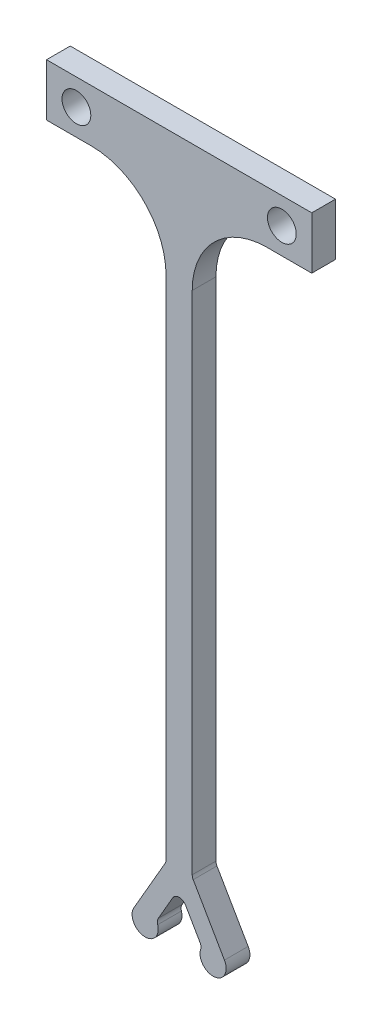
ISO-10303-21;
HEADER;
FILE_DESCRIPTION(('STEP AP214'),'2;1');
FILE_NAME('part.step','',(''),(''),'','','');
FILE_SCHEMA(('AUTOMOTIVE_DESIGN { 1 0 10303 214 1 1 1 1 }'));
ENDSEC;
DATA;
#1=APPLICATION_CONTEXT('core data for automotive mechanical design processes');
#2=APPLICATION_PROTOCOL_DEFINITION('international standard','automotive_design',2000,#1);
#3=PRODUCT_CONTEXT('',#1,'mechanical');
#4=PRODUCT('Part','Part','',(#3));
#5=PRODUCT_RELATED_PRODUCT_CATEGORY('part','',(#4));
#6=PRODUCT_DEFINITION_FORMATION('','',#4);
#7=PRODUCT_DEFINITION_CONTEXT('part definition',#1,'design');
#8=PRODUCT_DEFINITION('design','',#6,#7);
#9=PRODUCT_DEFINITION_SHAPE('','',#8);
#10=(LENGTH_UNIT() NAMED_UNIT(*) SI_UNIT(.MILLI.,.METRE.));
#11=(NAMED_UNIT(*) PLANE_ANGLE_UNIT() SI_UNIT($,.RADIAN.));
#12=(NAMED_UNIT(*) SI_UNIT($,.STERADIAN.) SOLID_ANGLE_UNIT());
#13=UNCERTAINTY_MEASURE_WITH_UNIT(LENGTH_MEASURE(1.E-05),#10,'distance_accuracy_value','');
#14=(GEOMETRIC_REPRESENTATION_CONTEXT(3) GLOBAL_UNCERTAINTY_ASSIGNED_CONTEXT((#13)) GLOBAL_UNIT_ASSIGNED_CONTEXT((#10,
#11,#12)) REPRESENTATION_CONTEXT('',''));
#15=CARTESIAN_POINT('',(0.,0.,0.));
#16=DIRECTION('',(0.,0.,1.));
#17=DIRECTION('',(1.,0.,0.));
#18=AXIS2_PLACEMENT_3D('',#15,#16,#17);
#19=CARTESIAN_POINT('',(-11.7499999999945,73.7189110867535,3.175));
#20=DIRECTION('',(0.,0.,-1.));
#21=DIRECTION('',(-1.,0.,0.));
#22=AXIS2_PLACEMENT_3D('',#19,#20,#21);
#23=PLANE('',#22);
#24=DIRECTION('',(1.,0.,0.));
#25=VECTOR('',#24,1.);
#26=CARTESIAN_POINT('',(-17.7499999997513,83.7189110867535,3.175));
#27=LINE('',#26,#25);
#28=CARTESIAN_POINT('',(-17.7499999997513,83.7189110867535,3.175));
#29=VERTEX_POINT('',#28);
#30=CARTESIAN_POINT('',(-11.7499999999945,83.7189110867535,3.175));
#31=VERTEX_POINT('',#30);
#32=EDGE_CURVE('E253',#29,#31,#27,.T.);
#33=ORIENTED_EDGE('',*,*,#32,.T.);
#34=CARTESIAN_POINT('',(-11.7499999999945,73.7189110867535,3.175));
#35=DIRECTION('',(0.,0.,-1.));
#36=DIRECTION('',(-1.,0.,0.));
#37=AXIS2_PLACEMENT_3D('',#34,#35,#36);
#38=CIRCLE('',#37,9.99999999999998);
#39=CARTESIAN_POINT('',(-1.74999999999453,73.7189110867527,3.175));
#40=VERTEX_POINT('',#39);
#41=EDGE_CURVE('E140',#31,#40,#38,.T.);
#42=ORIENTED_EDGE('',*,*,#41,.T.);
#43=DIRECTION('',(0.,-1.,0.));
#44=VECTOR('',#43,1.);
#45=CARTESIAN_POINT('',(-1.74999999999963,5.98686027918463,3.175));
#46=LINE('',#45,#44);
#47=CARTESIAN_POINT('',(-1.74999999999963,5.9868602791847,3.175));
#48=VERTEX_POINT('',#47);
#49=EDGE_CURVE('E304',#40,#48,#46,.T.);
#50=ORIENTED_EDGE('',*,*,#49,.T.);
#51=CARTESIAN_POINT('',(-2.74999999999963,5.9868602791847,3.175));
#52=DIRECTION('',(0.,0.,-1.));
#53=DIRECTION('',(1.,0.,0.));
#54=AXIS2_PLACEMENT_3D('',#51,#52,#53);
#55=CIRCLE('',#54,1.);
#56=CARTESIAN_POINT('',(-1.88397459621522,5.48686027918464,3.175));
#57=VERTEX_POINT('',#56);
#58=EDGE_CURVE('E321',#48,#57,#55,.T.);
#59=ORIENTED_EDGE('',*,*,#58,.T.);
#60=DIRECTION('',(-0.500000000000065,-0.866025403784401,0.));
#61=VECTOR('',#60,1.);
#62=CARTESIAN_POINT('',(-1.88397459621522,5.48686027918464,3.175));
#63=LINE('',#62,#61);
#64=CARTESIAN_POINT('',(-6.06217782649076,-1.74999999999973,3.175));
#65=VERTEX_POINT('',#64);
#66=EDGE_CURVE('E318',#57,#65,#63,.T.);
#67=ORIENTED_EDGE('',*,*,#66,.T.);
#68=CARTESIAN_POINT('',(-4.54663336986805,-2.62499999999984,3.175));
#69=DIRECTION('',(0.,0.,1.));
#70=DIRECTION('',(1.,0.,0.));
#71=AXIS2_PLACEMENT_3D('',#68,#69,#70);
#72=CIRCLE('',#71,1.75);
#73=CARTESIAN_POINT('',(-2.87322613480697,-2.11293728348437,3.175));
#74=VERTEX_POINT('',#73);
#75=EDGE_CURVE('E319',#65,#74,#72,.T.);
#76=ORIENTED_EDGE('',*,*,#75,.T.);
#77=CARTESIAN_POINT('',(-1.91699342905777,-1.8203300169041,3.175));
#78=DIRECTION('',(0.,0.,-1.));
#79=DIRECTION('',(-1.,0.,0.));
#80=AXIS2_PLACEMENT_3D('',#77,#78,#79);
#81=CIRCLE('',#80,1.);
#82=CARTESIAN_POINT('',(-2.78301883284217,-1.32033001690403,3.175));
#83=VERTEX_POINT('',#82);
#84=EDGE_CURVE('E323',#74,#83,#81,.T.);
#85=ORIENTED_EDGE('',*,*,#84,.T.);
#86=DIRECTION('',(0.500000000000065,0.866025403784401,0.));
#87=VECTOR('',#86,1.);
#88=CARTESIAN_POINT('',(-2.78301883284217,-1.32033001690403,3.175));
#89=LINE('',#88,#87);
#90=CARTESIAN_POINT('',(-0.866025403784479,1.99999999999901,3.175));
#91=VERTEX_POINT('',#90);
#92=EDGE_CURVE('E328',#83,#91,#89,.T.);
#93=ORIENTED_EDGE('',*,*,#92,.T.);
#94=CARTESIAN_POINT('',(0.,1.49999999999894,3.175));
#95=DIRECTION('',(0.,0.,-1.));
#96=DIRECTION('',(1.,0.,0.));
#97=AXIS2_PLACEMENT_3D('',#94,#95,#96);
#98=CIRCLE('',#97,1.);
#99=CARTESIAN_POINT('',(0.866025403784362,1.99999999999894,3.175));
#100=VERTEX_POINT('',#99);
#101=EDGE_CURVE('E332',#91,#100,#98,.T.);
#102=ORIENTED_EDGE('',*,*,#101,.T.);
#103=DIRECTION('',(0.499999999999997,-0.86602540378444,0.));
#104=VECTOR('',#103,1.);
#105=CARTESIAN_POINT('',(2.78301883284143,-1.32033001690361,3.175));
#106=LINE('',#105,#104);
#107=CARTESIAN_POINT('',(2.78301883284143,-1.32033001690361,3.175));
#108=VERTEX_POINT('',#107);
#109=EDGE_CURVE('E334',#100,#108,#106,.T.);
#110=ORIENTED_EDGE('',*,*,#109,.T.);
#111=CARTESIAN_POINT('',(1.91699342905699,-1.82033001690361,3.175));
#112=DIRECTION('',(0.,0.,-1.));
#113=DIRECTION('',(-1.,0.,0.));
#114=AXIS2_PLACEMENT_3D('',#111,#112,#113);
#115=CIRCLE('',#114,0.999999999999999);
#116=CARTESIAN_POINT('',(2.87322613480613,-2.11293728348389,3.175));
#117=VERTEX_POINT('',#116);
#118=EDGE_CURVE('E333',#108,#117,#115,.T.);
#119=ORIENTED_EDGE('',*,*,#118,.T.);
#120=CARTESIAN_POINT('',(4.54663336986725,-2.62499999999941,3.175));
#121=DIRECTION('',(0.,0.,1.));
#122=DIRECTION('',(1.,0.,0.));
#123=AXIS2_PLACEMENT_3D('',#120,#121,#122);
#124=CIRCLE('',#123,1.75000000000004);
#125=CARTESIAN_POINT('',(6.0621778264901,-1.74999999999937,3.175));
#126=VERTEX_POINT('',#125);
#127=EDGE_CURVE('E340',#117,#126,#124,.T.);
#128=ORIENTED_EDGE('',*,*,#127,.T.);
#129=DIRECTION('',(-0.499999999999997,0.86602540378444,0.));
#130=VECTOR('',#129,1.);
#131=CARTESIAN_POINT('',(1.8839745962163,5.48686027918331,3.175));
#132=LINE('',#131,#130);
#133=CARTESIAN_POINT('',(1.8839745962163,5.48686027918331,3.175));
#134=VERTEX_POINT('',#133);
#135=EDGE_CURVE('E338',#126,#134,#132,.T.);
#136=ORIENTED_EDGE('',*,*,#135,.T.);
#137=CARTESIAN_POINT('',(2.75000000000073,5.98686027918332,3.175));
#138=DIRECTION('',(0.,0.,-1.));
#139=DIRECTION('',(-1.,0.,0.));
#140=AXIS2_PLACEMENT_3D('',#137,#138,#139);
#141=CIRCLE('',#140,0.999999999999996);
#142=CARTESIAN_POINT('',(1.75000000000074,5.98686027918338,3.175));
#143=VERTEX_POINT('',#142);
#144=EDGE_CURVE('E342',#134,#143,#141,.T.);
#145=ORIENTED_EDGE('',*,*,#144,.T.);
#146=DIRECTION('',(0.,1.,0.));
#147=VECTOR('',#146,1.);
#148=CARTESIAN_POINT('',(1.75000000000074,5.98686027918338,3.175));
#149=LINE('',#148,#147);
#150=CARTESIAN_POINT('',(1.75000000000583,73.7189110867543,3.175));
#151=VERTEX_POINT('',#150);
#152=EDGE_CURVE('E345',#143,#151,#149,.T.);
#153=ORIENTED_EDGE('',*,*,#152,.T.);
#154=CARTESIAN_POINT('',(11.7500000000058,73.7189110867535,3.175));
#155=DIRECTION('',(0.,0.,-1.));
#156=DIRECTION('',(1.,0.,0.));
#157=AXIS2_PLACEMENT_3D('',#154,#155,#156);
#158=CIRCLE('',#157,9.99999999999998);
#159=CARTESIAN_POINT('',(11.7500000000058,83.7189110867535,3.175));
#160=VERTEX_POINT('',#159);
#161=EDGE_CURVE('E343',#151,#160,#158,.T.);
#162=ORIENTED_EDGE('',*,*,#161,.T.);
#163=DIRECTION('',(1.,0.,0.));
#164=VECTOR('',#163,1.);
#165=CARTESIAN_POINT('',(11.7500000000058,83.7189110867535,3.175));
#166=LINE('',#165,#164);
#167=CARTESIAN_POINT('',(17.750000000249,83.7189110867535,3.175));
#168=VERTEX_POINT('',#167);
#169=EDGE_CURVE('E195',#160,#168,#166,.T.);
#170=ORIENTED_EDGE('',*,*,#169,.T.);
#171=DIRECTION('',(0.,1.,0.));
#172=VECTOR('',#171,1.);
#173=CARTESIAN_POINT('',(17.750000000249,83.7189110867535,3.175));
#174=LINE('',#173,#172);
#175=CARTESIAN_POINT('',(17.750000000249,90.7189110867536,3.175));
#176=VERTEX_POINT('',#175);
#177=EDGE_CURVE('E190',#168,#176,#174,.T.);
#178=ORIENTED_EDGE('',*,*,#177,.T.);
#179=DIRECTION('',(-1.,0.,0.));
#180=VECTOR('',#179,1.);
#181=CARTESIAN_POINT('',(1.75000000024901,90.7189110867535,3.175));
#182=LINE('',#181,#180);
#183=CARTESIAN_POINT('',(-17.7499999997513,90.7189110867535,3.175));
#184=VERTEX_POINT('',#183);
#185=EDGE_CURVE('E192',#176,#184,#182,.T.);
#186=ORIENTED_EDGE('',*,*,#185,.T.);
#187=DIRECTION('',(0.,-1.,0.));
#188=VECTOR('',#187,1.);
#189=CARTESIAN_POINT('',(-17.7499999997513,90.7189110867535,3.175));
#190=LINE('',#189,#188);
#191=EDGE_CURVE('E58',#184,#29,#190,.T.);
#192=ORIENTED_EDGE('',*,*,#191,.T.);
#193=EDGE_LOOP('',(#33,#42,#50,#59,#67,#76,#85,#93,#102,#110,#119,#128,#136,#145,#153,#162,#170,
#178,#186,#192));
#194=FACE_BOUND('',#193,.T.);
#195=CARTESIAN_POINT('',(-13.7499999997513,87.2189110867535,3.175));
#196=DIRECTION('',(0.,0.,1.));
#197=DIRECTION('',(1.,0.,0.));
#198=AXIS2_PLACEMENT_3D('',#195,#196,#197);
#199=CIRCLE('',#198,1.925);
#200=CARTESIAN_POINT('',(-11.8249999997513,87.2189110867535,3.175));
#201=VERTEX_POINT('',#200);
#202=EDGE_CURVE('E216',#201,#201,#199,.T.);
#203=ORIENTED_EDGE('',*,*,#202,.F.);
#204=EDGE_LOOP('',(#203));
#205=FACE_BOUND('',#204,.T.);
#206=CARTESIAN_POINT('',(13.750000000249,87.2189110867535,3.175));
#207=DIRECTION('',(0.,0.,1.));
#208=DIRECTION('',(1.,0.,0.));
#209=AXIS2_PLACEMENT_3D('',#206,#207,#208);
#210=CIRCLE('',#209,1.925);
#211=CARTESIAN_POINT('',(15.675000000249,87.2189110867535,3.175));
#212=VERTEX_POINT('',#211);
#213=EDGE_CURVE('E387',#212,#212,#210,.T.);
#214=ORIENTED_EDGE('',*,*,#213,.F.);
#215=EDGE_LOOP('',(#214));
#216=FACE_BOUND('',#215,.T.);
#217=ADVANCED_FACE('F43',(#194,#205,#216),#23,.F.);
#218=CARTESIAN_POINT('',(-11.7499999999945,73.7189110867535,0.));
#219=DIRECTION('',(0.,0.,-1.));
#220=DIRECTION('',(-1.,0.,0.));
#221=AXIS2_PLACEMENT_3D('',#218,#219,#220);
#222=PLANE('',#221);
#223=CARTESIAN_POINT('',(-13.7499999997513,87.2189110867535,0.));
#224=DIRECTION('',(0.,0.,1.));
#225=DIRECTION('',(1.,0.,0.));
#226=AXIS2_PLACEMENT_3D('',#223,#224,#225);
#227=CIRCLE('',#226,1.925);
#228=CARTESIAN_POINT('',(-11.8249999997513,87.2189110867535,0.));
#229=VERTEX_POINT('',#228);
#230=EDGE_CURVE('E391',#229,#229,#227,.T.);
#231=ORIENTED_EDGE('',*,*,#230,.T.);
#232=EDGE_LOOP('',(#231));
#233=FACE_BOUND('',#232,.T.);
#234=DIRECTION('',(1.,0.,0.));
#235=VECTOR('',#234,1.);
#236=CARTESIAN_POINT('',(-17.7499999997513,83.7189110867535,0.));
#237=LINE('',#236,#235);
#238=CARTESIAN_POINT('',(-17.7499999997513,83.7189110867535,0.));
#239=VERTEX_POINT('',#238);
#240=CARTESIAN_POINT('',(-11.7499999999945,83.7189110867535,0.));
#241=VERTEX_POINT('',#240);
#242=EDGE_CURVE('E215',#239,#241,#237,.T.);
#243=ORIENTED_EDGE('',*,*,#242,.F.);
#244=DIRECTION('',(0.,-1.,0.));
#245=VECTOR('',#244,1.);
#246=CARTESIAN_POINT('',(-17.7499999997513,90.7189110867535,0.));
#247=LINE('',#246,#245);
#248=CARTESIAN_POINT('',(-17.7499999997513,90.7189110867535,0.));
#249=VERTEX_POINT('',#248);
#250=EDGE_CURVE('E128',#249,#239,#247,.T.);
#251=ORIENTED_EDGE('',*,*,#250,.F.);
#252=DIRECTION('',(-1.,0.,0.));
#253=VECTOR('',#252,1.);
#254=CARTESIAN_POINT('',(-1.74999999975131,90.7189110867535,0.));
#255=LINE('',#254,#253);
#256=CARTESIAN_POINT('',(17.750000000249,90.7189110867536,0.));
#257=VERTEX_POINT('',#256);
#258=EDGE_CURVE('E121',#257,#249,#255,.T.);
#259=ORIENTED_EDGE('',*,*,#258,.F.);
#260=DIRECTION('',(0.,1.,0.));
#261=VECTOR('',#260,1.);
#262=CARTESIAN_POINT('',(17.750000000249,83.7189110867535,0.));
#263=LINE('',#262,#261);
#264=CARTESIAN_POINT('',(17.750000000249,83.7189110867535,0.));
#265=VERTEX_POINT('',#264);
#266=EDGE_CURVE('E205',#265,#257,#263,.T.);
#267=ORIENTED_EDGE('',*,*,#266,.F.);
#268=DIRECTION('',(1.,0.,0.));
#269=VECTOR('',#268,1.);
#270=CARTESIAN_POINT('',(11.7500000000058,83.7189110867535,0.));
#271=LINE('',#270,#269);
#272=CARTESIAN_POINT('',(11.7500000000058,83.7189110867535,0.));
#273=VERTEX_POINT('',#272);
#274=EDGE_CURVE('E247',#273,#265,#271,.T.);
#275=ORIENTED_EDGE('',*,*,#274,.F.);
#276=CARTESIAN_POINT('',(11.7500000000058,73.7189110867535,0.));
#277=DIRECTION('',(0.,0.,-1.));
#278=DIRECTION('',(1.,0.,0.));
#279=AXIS2_PLACEMENT_3D('',#276,#277,#278);
#280=CIRCLE('',#279,9.99999999999998);
#281=CARTESIAN_POINT('',(1.75000000000583,73.7189110867543,0.));
#282=VERTEX_POINT('',#281);
#283=EDGE_CURVE('E243',#282,#273,#280,.T.);
#284=ORIENTED_EDGE('',*,*,#283,.F.);
#285=DIRECTION('',(0.,1.,0.));
#286=VECTOR('',#285,1.);
#287=CARTESIAN_POINT('',(1.75000000000074,5.98686027918338,0.));
#288=LINE('',#287,#286);
#289=CARTESIAN_POINT('',(1.75000000000074,5.98686027918338,0.));
#290=VERTEX_POINT('',#289);
#291=EDGE_CURVE('E245',#290,#282,#288,.T.);
#292=ORIENTED_EDGE('',*,*,#291,.F.);
#293=CARTESIAN_POINT('',(2.75000000000073,5.98686027918332,0.));
#294=DIRECTION('',(0.,0.,-1.));
#295=DIRECTION('',(-1.,0.,0.));
#296=AXIS2_PLACEMENT_3D('',#293,#294,#295);
#297=CIRCLE('',#296,0.999999999999996);
#298=CARTESIAN_POINT('',(1.8839745962163,5.48686027918331,0.));
#299=VERTEX_POINT('',#298);
#300=EDGE_CURVE('E238',#299,#290,#297,.T.);
#301=ORIENTED_EDGE('',*,*,#300,.F.);
#302=DIRECTION('',(-0.499999999999997,0.86602540378444,0.));
#303=VECTOR('',#302,1.);
#304=CARTESIAN_POINT('',(1.8839745962163,5.48686027918331,0.));
#305=LINE('',#304,#303);
#306=CARTESIAN_POINT('',(6.0621778264901,-1.74999999999937,0.));
#307=VERTEX_POINT('',#306);
#308=EDGE_CURVE('E236',#307,#299,#305,.T.);
#309=ORIENTED_EDGE('',*,*,#308,.F.);
#310=CARTESIAN_POINT('',(4.54663336986725,-2.62499999999941,0.));
#311=DIRECTION('',(0.,0.,1.));
#312=DIRECTION('',(1.,0.,0.));
#313=AXIS2_PLACEMENT_3D('',#310,#311,#312);
#314=CIRCLE('',#313,1.75000000000004);
#315=CARTESIAN_POINT('',(2.87322613480613,-2.11293728348389,0.));
#316=VERTEX_POINT('',#315);
#317=EDGE_CURVE('E237',#316,#307,#314,.T.);
#318=ORIENTED_EDGE('',*,*,#317,.F.);
#319=CARTESIAN_POINT('',(1.91699342905699,-1.82033001690361,0.));
#320=DIRECTION('',(0.,0.,-1.));
#321=DIRECTION('',(-1.,0.,0.));
#322=AXIS2_PLACEMENT_3D('',#319,#320,#321);
#323=CIRCLE('',#322,0.999999999999999);
#324=CARTESIAN_POINT('',(2.78301883284143,-1.32033001690361,0.));
#325=VERTEX_POINT('',#324);
#326=EDGE_CURVE('E231',#325,#316,#323,.T.);
#327=ORIENTED_EDGE('',*,*,#326,.F.);
#328=DIRECTION('',(0.499999999999997,-0.86602540378444,0.));
#329=VECTOR('',#328,1.);
#330=CARTESIAN_POINT('',(2.78301883284143,-1.32033001690361,0.));
#331=LINE('',#330,#329);
#332=CARTESIAN_POINT('',(0.866025403784362,1.99999999999894,0.));
#333=VERTEX_POINT('',#332);
#334=EDGE_CURVE('E234',#333,#325,#331,.T.);
#335=ORIENTED_EDGE('',*,*,#334,.F.);
#336=CARTESIAN_POINT('',(0.,1.49999999999894,0.));
#337=DIRECTION('',(0.,0.,-1.));
#338=DIRECTION('',(1.,0.,0.));
#339=AXIS2_PLACEMENT_3D('',#336,#337,#338);
#340=CIRCLE('',#339,1.);
#341=CARTESIAN_POINT('',(-0.866025403784479,1.99999999999901,0.));
#342=VERTEX_POINT('',#341);
#343=EDGE_CURVE('E229',#342,#333,#340,.T.);
#344=ORIENTED_EDGE('',*,*,#343,.F.);
#345=DIRECTION('',(0.500000000000065,0.866025403784401,0.));
#346=VECTOR('',#345,1.);
#347=CARTESIAN_POINT('',(-2.78301883284217,-1.32033001690403,0.));
#348=LINE('',#347,#346);
#349=CARTESIAN_POINT('',(-2.78301883284217,-1.32033001690403,0.));
#350=VERTEX_POINT('',#349);
#351=EDGE_CURVE('E227',#350,#342,#348,.T.);
#352=ORIENTED_EDGE('',*,*,#351,.F.);
#353=CARTESIAN_POINT('',(-1.91699342905777,-1.8203300169041,0.));
#354=DIRECTION('',(0.,0.,-1.));
#355=DIRECTION('',(-1.,0.,0.));
#356=AXIS2_PLACEMENT_3D('',#353,#354,#355);
#357=CIRCLE('',#356,1.);
#358=CARTESIAN_POINT('',(-2.87322613480697,-2.11293728348437,0.));
#359=VERTEX_POINT('',#358);
#360=EDGE_CURVE('E226',#359,#350,#357,.T.);
#361=ORIENTED_EDGE('',*,*,#360,.F.);
#362=CARTESIAN_POINT('',(-4.54663336986805,-2.62499999999984,0.));
#363=DIRECTION('',(0.,0.,1.));
#364=DIRECTION('',(1.,0.,0.));
#365=AXIS2_PLACEMENT_3D('',#362,#363,#364);
#366=CIRCLE('',#365,1.75);
#367=CARTESIAN_POINT('',(-6.06217782649076,-1.74999999999973,0.));
#368=VERTEX_POINT('',#367);
#369=EDGE_CURVE('E221',#368,#359,#366,.T.);
#370=ORIENTED_EDGE('',*,*,#369,.F.);
#371=DIRECTION('',(-0.500000000000065,-0.866025403784401,0.));
#372=VECTOR('',#371,1.);
#373=CARTESIAN_POINT('',(-1.88397459621522,5.48686027918464,0.));
#374=LINE('',#373,#372);
#375=CARTESIAN_POINT('',(-1.88397459621522,5.48686027918464,0.));
#376=VERTEX_POINT('',#375);
#377=EDGE_CURVE('E225',#376,#368,#374,.T.);
#378=ORIENTED_EDGE('',*,*,#377,.F.);
#379=CARTESIAN_POINT('',(-2.74999999999963,5.9868602791847,0.));
#380=DIRECTION('',(0.,0.,-1.));
#381=DIRECTION('',(1.,0.,0.));
#382=AXIS2_PLACEMENT_3D('',#379,#380,#381);
#383=CIRCLE('',#382,1.);
#384=CARTESIAN_POINT('',(-1.74999999999963,5.9868602791847,0.));
#385=VERTEX_POINT('',#384);
#386=EDGE_CURVE('E219',#385,#376,#383,.T.);
#387=ORIENTED_EDGE('',*,*,#386,.F.);
#388=DIRECTION('',(0.,-1.,0.));
#389=VECTOR('',#388,1.);
#390=CARTESIAN_POINT('',(-1.74999999999963,5.98686027918463,0.));
#391=LINE('',#390,#389);
#392=CARTESIAN_POINT('',(-1.74999999999453,73.7189110867527,0.));
#393=VERTEX_POINT('',#392);
#394=EDGE_CURVE('E217',#393,#385,#391,.T.);
#395=ORIENTED_EDGE('',*,*,#394,.F.);
#396=CARTESIAN_POINT('',(-11.7499999999945,73.7189110867535,0.));
#397=DIRECTION('',(0.,0.,-1.));
#398=DIRECTION('',(-1.,0.,0.));
#399=AXIS2_PLACEMENT_3D('',#396,#397,#398);
#400=CIRCLE('',#399,9.99999999999998);
#401=EDGE_CURVE('E214',#241,#393,#400,.T.);
#402=ORIENTED_EDGE('',*,*,#401,.F.);
#403=EDGE_LOOP('',(#243,#251,#259,#267,#275,#284,#292,#301,#309,#318,#327,#335,#344,#352,#361,
#370,#378,#387,#395,#402));
#404=FACE_BOUND('',#403,.T.);
#405=CARTESIAN_POINT('',(13.750000000249,87.2189110867535,0.));
#406=DIRECTION('',(0.,0.,1.));
#407=DIRECTION('',(1.,0.,0.));
#408=AXIS2_PLACEMENT_3D('',#405,#406,#407);
#409=CIRCLE('',#408,1.925);
#410=CARTESIAN_POINT('',(15.675000000249,87.2189110867535,0.));
#411=VERTEX_POINT('',#410);
#412=EDGE_CURVE('E386',#411,#411,#409,.T.);
#413=ORIENTED_EDGE('',*,*,#412,.T.);
#414=EDGE_LOOP('',(#413));
#415=FACE_BOUND('',#414,.T.);
#416=ADVANCED_FACE('F308',(#233,#404,#415),#222,.T.);
#417=CARTESIAN_POINT('',(-17.7499999997513,83.7189110867535,3.175));
#418=DIRECTION('',(0.,1.,0.));
#419=DIRECTION('',(-1.,0.,0.));
#420=AXIS2_PLACEMENT_3D('',#417,#418,#419);
#421=PLANE('',#420);
#422=ORIENTED_EDGE('',*,*,#242,.T.);
#423=DIRECTION('',(0.,0.,-1.));
#424=VECTOR('',#423,1.);
#425=CARTESIAN_POINT('',(-11.7499999999945,83.7189110867535,3.175));
#426=LINE('',#425,#424);
#427=EDGE_CURVE('E11',#31,#241,#426,.T.);
#428=ORIENTED_EDGE('',*,*,#427,.F.);
#429=ORIENTED_EDGE('',*,*,#32,.F.);
#430=DIRECTION('',(0.,0.,-1.));
#431=VECTOR('',#430,1.);
#432=CARTESIAN_POINT('',(-17.7499999997513,83.7189110867535,3.175));
#433=LINE('',#432,#431);
#434=EDGE_CURVE('E208',#29,#239,#433,.T.);
#435=ORIENTED_EDGE('',*,*,#434,.T.);
#436=EDGE_LOOP('',(#422,#428,#429,#435));
#437=FACE_BOUND('',#436,.T.);
#438=ADVANCED_FACE('F44',(#437),#421,.F.);
#439=CARTESIAN_POINT('',(-11.7499999999945,73.7189110867535,3.175));
#440=DIRECTION('',(0.,0.,-1.));
#441=DIRECTION('',(-1.,0.,0.));
#442=AXIS2_PLACEMENT_3D('',#439,#440,#441);
#443=CYLINDRICAL_SURFACE('',#442,9.99999999999998);
#444=ORIENTED_EDGE('',*,*,#401,.T.);
#445=DIRECTION('',(0.,0.,-1.));
#446=VECTOR('',#445,1.);
#447=CARTESIAN_POINT('',(-1.74999999999453,73.7189110867527,3.175));
#448=LINE('',#447,#446);
#449=EDGE_CURVE('E55',#40,#393,#448,.T.);
#450=ORIENTED_EDGE('',*,*,#449,.F.);
#451=ORIENTED_EDGE('',*,*,#41,.F.);
#452=ORIENTED_EDGE('',*,*,#427,.T.);
#453=EDGE_LOOP('',(#444,#450,#451,#452));
#454=FACE_BOUND('',#453,.T.);
#455=ADVANCED_FACE('F551',(#454),#443,.F.);
#456=CARTESIAN_POINT('',(-1.74999999999963,5.98686027918463,3.175));
#457=DIRECTION('',(1.,0.,0.));
#458=DIRECTION('',(0.,1.,0.));
#459=AXIS2_PLACEMENT_3D('',#456,#457,#458);
#460=PLANE('',#459);
#461=ORIENTED_EDGE('',*,*,#394,.T.);
#462=DIRECTION('',(0.,0.,-1.));
#463=VECTOR('',#462,1.);
#464=CARTESIAN_POINT('',(-1.74999999999963,5.9868602791847,3.175));
#465=LINE('',#464,#463);
#466=EDGE_CURVE('E294',#48,#385,#465,.T.);
#467=ORIENTED_EDGE('',*,*,#466,.F.);
#468=ORIENTED_EDGE('',*,*,#49,.F.);
#469=ORIENTED_EDGE('',*,*,#449,.T.);
#470=EDGE_LOOP('',(#461,#467,#468,#469));
#471=FACE_BOUND('',#470,.T.);
#472=ADVANCED_FACE('F299',(#471),#460,.F.);
#473=CARTESIAN_POINT('',(-2.74999999999963,5.9868602791847,3.175));
#474=DIRECTION('',(0.,0.,-1.));
#475=DIRECTION('',(-1.,0.,0.));
#476=AXIS2_PLACEMENT_3D('',#473,#474,#475);
#477=CYLINDRICAL_SURFACE('',#476,1.);
#478=ORIENTED_EDGE('',*,*,#386,.T.);
#479=DIRECTION('',(0.,0.,-1.));
#480=VECTOR('',#479,1.);
#481=CARTESIAN_POINT('',(-1.88397459621522,5.48686027918464,3.175));
#482=LINE('',#481,#480);
#483=EDGE_CURVE('E292',#57,#376,#482,.T.);
#484=ORIENTED_EDGE('',*,*,#483,.F.);
#485=ORIENTED_EDGE('',*,*,#58,.F.);
#486=ORIENTED_EDGE('',*,*,#466,.T.);
#487=EDGE_LOOP('',(#478,#484,#485,#486));
#488=FACE_BOUND('',#487,.T.);
#489=ADVANCED_FACE('F315',(#488),#477,.F.);
#490=CARTESIAN_POINT('',(-1.88397459621522,5.48686027918464,3.175));
#491=DIRECTION('',(0.866025403784401,-0.500000000000065,0.));
#492=DIRECTION('',(0.500000000000065,0.866025403784401,0.));
#493=AXIS2_PLACEMENT_3D('',#490,#491,#492);
#494=PLANE('',#493);
#495=ORIENTED_EDGE('',*,*,#377,.T.);
#496=DIRECTION('',(0.,0.,-1.));
#497=VECTOR('',#496,1.);
#498=CARTESIAN_POINT('',(-6.06217782649076,-1.74999999999973,3.175));
#499=LINE('',#498,#497);
#500=EDGE_CURVE('E290',#65,#368,#499,.T.);
#501=ORIENTED_EDGE('',*,*,#500,.F.);
#502=ORIENTED_EDGE('',*,*,#66,.F.);
#503=ORIENTED_EDGE('',*,*,#483,.T.);
#504=EDGE_LOOP('',(#495,#501,#502,#503));
#505=FACE_BOUND('',#504,.T.);
#506=ADVANCED_FACE('F316',(#505),#494,.F.);
#507=CARTESIAN_POINT('',(-4.54663336986805,-2.62499999999984,3.175));
#508=DIRECTION('',(0.,0.,-1.));
#509=DIRECTION('',(-1.,0.,0.));
#510=AXIS2_PLACEMENT_3D('',#507,#508,#509);
#511=CYLINDRICAL_SURFACE('',#510,1.75);
#512=ORIENTED_EDGE('',*,*,#369,.T.);
#513=DIRECTION('',(0.,0.,-1.));
#514=VECTOR('',#513,1.);
#515=CARTESIAN_POINT('',(-2.87322613480697,-2.11293728348437,3.175));
#516=LINE('',#515,#514);
#517=EDGE_CURVE('E284',#74,#359,#516,.T.);
#518=ORIENTED_EDGE('',*,*,#517,.F.);
#519=ORIENTED_EDGE('',*,*,#75,.F.);
#520=ORIENTED_EDGE('',*,*,#500,.T.);
#521=EDGE_LOOP('',(#512,#518,#519,#520));
#522=FACE_BOUND('',#521,.T.);
#523=ADVANCED_FACE('F525',(#522),#511,.T.);
#524=CARTESIAN_POINT('',(-1.91699342905777,-1.8203300169041,3.175));
#525=DIRECTION('',(0.,0.,-1.));
#526=DIRECTION('',(-1.,0.,0.));
#527=AXIS2_PLACEMENT_3D('',#524,#525,#526);
#528=CYLINDRICAL_SURFACE('',#527,1.);
#529=ORIENTED_EDGE('',*,*,#360,.T.);
#530=DIRECTION('',(0.,0.,-1.));
#531=VECTOR('',#530,1.);
#532=CARTESIAN_POINT('',(-2.78301883284217,-1.32033001690403,3.175));
#533=LINE('',#532,#531);
#534=EDGE_CURVE('E285',#83,#350,#533,.T.);
#535=ORIENTED_EDGE('',*,*,#534,.F.);
#536=ORIENTED_EDGE('',*,*,#84,.F.);
#537=ORIENTED_EDGE('',*,*,#517,.T.);
#538=EDGE_LOOP('',(#529,#535,#536,#537));
#539=FACE_BOUND('',#538,.T.);
#540=ADVANCED_FACE('F514',(#539),#528,.F.);
#541=CARTESIAN_POINT('',(-2.78301883284217,-1.32033001690403,3.175));
#542=DIRECTION('',(-0.866025403784401,0.500000000000065,0.));
#543=DIRECTION('',(-0.500000000000065,-0.866025403784401,0.));
#544=AXIS2_PLACEMENT_3D('',#541,#542,#543);
#545=PLANE('',#544);
#546=ORIENTED_EDGE('',*,*,#351,.T.);
#547=DIRECTION('',(0.,0.,-1.));
#548=VECTOR('',#547,1.);
#549=CARTESIAN_POINT('',(-0.866025403784479,1.99999999999901,3.175));
#550=LINE('',#549,#548);
#551=EDGE_CURVE('E276',#91,#342,#550,.T.);
#552=ORIENTED_EDGE('',*,*,#551,.F.);
#553=ORIENTED_EDGE('',*,*,#92,.F.);
#554=ORIENTED_EDGE('',*,*,#534,.T.);
#555=EDGE_LOOP('',(#546,#552,#553,#554));
#556=FACE_BOUND('',#555,.T.);
#557=ADVANCED_FACE('F504',(#556),#545,.F.);
#558=CARTESIAN_POINT('',(0.,1.49999999999894,3.175));
#559=DIRECTION('',(0.,0.,-1.));
#560=DIRECTION('',(-1.,0.,0.));
#561=AXIS2_PLACEMENT_3D('',#558,#559,#560);
#562=CYLINDRICAL_SURFACE('',#561,1.);
#563=ORIENTED_EDGE('',*,*,#343,.T.);
#564=DIRECTION('',(0.,0.,-1.));
#565=VECTOR('',#564,1.);
#566=CARTESIAN_POINT('',(0.866025403784362,1.99999999999894,3.175));
#567=LINE('',#566,#565);
#568=EDGE_CURVE('E277',#100,#333,#567,.T.);
#569=ORIENTED_EDGE('',*,*,#568,.F.);
#570=ORIENTED_EDGE('',*,*,#101,.F.);
#571=ORIENTED_EDGE('',*,*,#551,.T.);
#572=EDGE_LOOP('',(#563,#569,#570,#571));
#573=FACE_BOUND('',#572,.T.);
#574=ADVANCED_FACE('F497',(#573),#562,.F.);
#575=CARTESIAN_POINT('',(2.78301883284143,-1.32033001690361,3.175));
#576=DIRECTION('',(0.86602540378444,0.499999999999997,0.));
#577=DIRECTION('',(-0.499999999999998,0.86602540378444,0.));
#578=AXIS2_PLACEMENT_3D('',#575,#576,#577);
#579=PLANE('',#578);
#580=ORIENTED_EDGE('',*,*,#334,.T.);
#581=DIRECTION('',(0.,0.,-1.));
#582=VECTOR('',#581,1.);
#583=CARTESIAN_POINT('',(2.78301883284143,-1.32033001690361,3.175));
#584=LINE('',#583,#582);
#585=EDGE_CURVE('E272',#108,#325,#584,.T.);
#586=ORIENTED_EDGE('',*,*,#585,.F.);
#587=ORIENTED_EDGE('',*,*,#109,.F.);
#588=ORIENTED_EDGE('',*,*,#568,.T.);
#589=EDGE_LOOP('',(#580,#586,#587,#588));
#590=FACE_BOUND('',#589,.T.);
#591=ADVANCED_FACE('F490',(#590),#579,.F.);
#592=CARTESIAN_POINT('',(1.91699342905699,-1.82033001690361,3.175));
#593=DIRECTION('',(0.,0.,-1.));
#594=DIRECTION('',(-1.,0.,0.));
#595=AXIS2_PLACEMENT_3D('',#592,#593,#594);
#596=CYLINDRICAL_SURFACE('',#595,0.999999999999999);
#597=ORIENTED_EDGE('',*,*,#326,.T.);
#598=DIRECTION('',(0.,0.,-1.));
#599=VECTOR('',#598,1.);
#600=CARTESIAN_POINT('',(2.87322613480613,-2.11293728348389,3.175));
#601=LINE('',#600,#599);
#602=EDGE_CURVE('E269',#117,#316,#601,.T.);
#603=ORIENTED_EDGE('',*,*,#602,.F.);
#604=ORIENTED_EDGE('',*,*,#118,.F.);
#605=ORIENTED_EDGE('',*,*,#585,.T.);
#606=EDGE_LOOP('',(#597,#603,#604,#605));
#607=FACE_BOUND('',#606,.T.);
#608=ADVANCED_FACE('F476',(#607),#596,.F.);
#609=CARTESIAN_POINT('',(4.54663336986725,-2.62499999999941,3.175));
#610=DIRECTION('',(0.,0.,-1.));
#611=DIRECTION('',(-1.,0.,0.));
#612=AXIS2_PLACEMENT_3D('',#609,#610,#611);
#613=CYLINDRICAL_SURFACE('',#612,1.75000000000004);
#614=ORIENTED_EDGE('',*,*,#317,.T.);
#615=DIRECTION('',(0.,0.,-1.));
#616=VECTOR('',#615,1.);
#617=CARTESIAN_POINT('',(6.0621778264901,-1.74999999999937,3.175));
#618=LINE('',#617,#616);
#619=EDGE_CURVE('E270',#126,#307,#618,.T.);
#620=ORIENTED_EDGE('',*,*,#619,.F.);
#621=ORIENTED_EDGE('',*,*,#127,.F.);
#622=ORIENTED_EDGE('',*,*,#602,.T.);
#623=EDGE_LOOP('',(#614,#620,#621,#622));
#624=FACE_BOUND('',#623,.T.);
#625=ADVANCED_FACE('F466',(#624),#613,.T.);
#626=CARTESIAN_POINT('',(1.8839745962163,5.48686027918331,3.175));
#627=DIRECTION('',(-0.86602540378444,-0.499999999999997,0.));
#628=DIRECTION('',(0.499999999999997,-0.86602540378444,0.));
#629=AXIS2_PLACEMENT_3D('',#626,#627,#628);
#630=PLANE('',#629);
#631=ORIENTED_EDGE('',*,*,#308,.T.);
#632=DIRECTION('',(0.,0.,-1.));
#633=VECTOR('',#632,1.);
#634=CARTESIAN_POINT('',(1.8839745962163,5.48686027918331,3.175));
#635=LINE('',#634,#633);
#636=EDGE_CURVE('E262',#134,#299,#635,.T.);
#637=ORIENTED_EDGE('',*,*,#636,.F.);
#638=ORIENTED_EDGE('',*,*,#135,.F.);
#639=ORIENTED_EDGE('',*,*,#619,.T.);
#640=EDGE_LOOP('',(#631,#637,#638,#639));
#641=FACE_BOUND('',#640,.T.);
#642=ADVANCED_FACE('F458',(#641),#630,.F.);
#643=CARTESIAN_POINT('',(2.75000000000073,5.98686027918332,3.175));
#644=DIRECTION('',(0.,0.,-1.));
#645=DIRECTION('',(-1.,0.,0.));
#646=AXIS2_PLACEMENT_3D('',#643,#644,#645);
#647=CYLINDRICAL_SURFACE('',#646,0.999999999999996);
#648=ORIENTED_EDGE('',*,*,#300,.T.);
#649=DIRECTION('',(0.,0.,-1.));
#650=VECTOR('',#649,1.);
#651=CARTESIAN_POINT('',(1.75000000000074,5.98686027918338,3.175));
#652=LINE('',#651,#650);
#653=EDGE_CURVE('E261',#143,#290,#652,.T.);
#654=ORIENTED_EDGE('',*,*,#653,.F.);
#655=ORIENTED_EDGE('',*,*,#144,.F.);
#656=ORIENTED_EDGE('',*,*,#636,.T.);
#657=EDGE_LOOP('',(#648,#654,#655,#656));
#658=FACE_BOUND('',#657,.T.);
#659=ADVANCED_FACE('F452',(#658),#647,.F.);
#660=CARTESIAN_POINT('',(1.75000000000074,5.98686027918338,3.175));
#661=DIRECTION('',(-1.,0.,0.));
#662=DIRECTION('',(0.,-1.,0.));
#663=AXIS2_PLACEMENT_3D('',#660,#661,#662);
#664=PLANE('',#663);
#665=ORIENTED_EDGE('',*,*,#291,.T.);
#666=DIRECTION('',(0.,0.,-1.));
#667=VECTOR('',#666,1.);
#668=CARTESIAN_POINT('',(1.75000000000583,73.7189110867543,3.175));
#669=LINE('',#668,#667);
#670=EDGE_CURVE('E256',#151,#282,#669,.T.);
#671=ORIENTED_EDGE('',*,*,#670,.F.);
#672=ORIENTED_EDGE('',*,*,#152,.F.);
#673=ORIENTED_EDGE('',*,*,#653,.T.);
#674=EDGE_LOOP('',(#665,#671,#672,#673));
#675=FACE_BOUND('',#674,.T.);
#676=ADVANCED_FACE('F444',(#675),#664,.F.);
#677=CARTESIAN_POINT('',(11.7500000000058,73.7189110867535,3.175));
#678=DIRECTION('',(0.,0.,-1.));
#679=DIRECTION('',(-1.,0.,0.));
#680=AXIS2_PLACEMENT_3D('',#677,#678,#679);
#681=CYLINDRICAL_SURFACE('',#680,9.99999999999998);
#682=ORIENTED_EDGE('',*,*,#283,.T.);
#683=DIRECTION('',(0.,0.,-1.));
#684=VECTOR('',#683,1.);
#685=CARTESIAN_POINT('',(11.7500000000058,83.7189110867535,3.175));
#686=LINE('',#685,#684);
#687=EDGE_CURVE('E254',#160,#273,#686,.T.);
#688=ORIENTED_EDGE('',*,*,#687,.F.);
#689=ORIENTED_EDGE('',*,*,#161,.F.);
#690=ORIENTED_EDGE('',*,*,#670,.T.);
#691=EDGE_LOOP('',(#682,#688,#689,#690));
#692=FACE_BOUND('',#691,.T.);
#693=ADVANCED_FACE('F351',(#692),#681,.F.);
#694=CARTESIAN_POINT('',(11.7500000000058,83.7189110867535,3.175));
#695=DIRECTION('',(0.,1.,0.));
#696=DIRECTION('',(0.,0.,1.));
#697=AXIS2_PLACEMENT_3D('',#694,#695,#696);
#698=PLANE('',#697);
#699=ORIENTED_EDGE('',*,*,#274,.T.);
#700=DIRECTION('',(0.,0.,-1.));
#701=VECTOR('',#700,1.);
#702=CARTESIAN_POINT('',(17.750000000249,83.7189110867535,3.175));
#703=LINE('',#702,#701);
#704=EDGE_CURVE('E201',#168,#265,#703,.T.);
#705=ORIENTED_EDGE('',*,*,#704,.F.);
#706=ORIENTED_EDGE('',*,*,#169,.F.);
#707=ORIENTED_EDGE('',*,*,#687,.T.);
#708=EDGE_LOOP('',(#699,#705,#706,#707));
#709=FACE_BOUND('',#708,.T.);
#710=ADVANCED_FACE('F354',(#709),#698,.F.);
#711=CARTESIAN_POINT('',(17.750000000249,83.7189110867535,3.175));
#712=DIRECTION('',(-1.,0.,0.));
#713=DIRECTION('',(0.,0.,1.));
#714=AXIS2_PLACEMENT_3D('',#711,#712,#713);
#715=PLANE('',#714);
#716=ORIENTED_EDGE('',*,*,#266,.T.);
#717=DIRECTION('',(0.,0.,-1.));
#718=VECTOR('',#717,1.);
#719=CARTESIAN_POINT('',(17.750000000249,90.7189110867536,3.175));
#720=LINE('',#719,#718);
#721=EDGE_CURVE('E200',#176,#257,#720,.T.);
#722=ORIENTED_EDGE('',*,*,#721,.F.);
#723=ORIENTED_EDGE('',*,*,#177,.F.);
#724=ORIENTED_EDGE('',*,*,#704,.T.);
#725=EDGE_LOOP('',(#716,#722,#723,#724));
#726=FACE_BOUND('',#725,.T.);
#727=ADVANCED_FACE('F199',(#726),#715,.F.);
#728=CARTESIAN_POINT('',(-1.74999999975131,90.7189110867535,3.175));
#729=DIRECTION('',(0.,-1.,0.));
#730=DIRECTION('',(1.,0.,0.));
#731=AXIS2_PLACEMENT_3D('',#728,#729,#730);
#732=PLANE('',#731);
#733=ORIENTED_EDGE('',*,*,#258,.T.);
#734=DIRECTION('',(0.,0.,-1.));
#735=VECTOR('',#734,1.);
#736=CARTESIAN_POINT('',(-17.7499999997513,90.7189110867535,3.175));
#737=LINE('',#736,#735);
#738=EDGE_CURVE('E204',#184,#249,#737,.T.);
#739=ORIENTED_EDGE('',*,*,#738,.F.);
#740=ORIENTED_EDGE('',*,*,#185,.F.);
#741=ORIENTED_EDGE('',*,*,#721,.T.);
#742=EDGE_LOOP('',(#733,#739,#740,#741));
#743=FACE_BOUND('',#742,.T.);
#744=ADVANCED_FACE('F206',(#743),#732,.F.);
#745=CARTESIAN_POINT('',(-17.7499999997513,90.7189110867535,3.175));
#746=DIRECTION('',(1.,0.,0.));
#747=DIRECTION('',(0.,1.,0.));
#748=AXIS2_PLACEMENT_3D('',#745,#746,#747);
#749=PLANE('',#748);
#750=ORIENTED_EDGE('',*,*,#250,.T.);
#751=ORIENTED_EDGE('',*,*,#434,.F.);
#752=ORIENTED_EDGE('',*,*,#191,.F.);
#753=ORIENTED_EDGE('',*,*,#738,.T.);
#754=EDGE_LOOP('',(#750,#751,#752,#753));
#755=FACE_BOUND('',#754,.T.);
#756=ADVANCED_FACE('F356',(#755),#749,.F.);
#757=CARTESIAN_POINT('',(-13.7499999997513,87.2189110867535,3.175));
#758=DIRECTION('',(0.,0.,-1.));
#759=DIRECTION('',(-1.,0.,0.));
#760=AXIS2_PLACEMENT_3D('',#757,#758,#759);
#761=CYLINDRICAL_SURFACE('',#760,1.925);
#762=ORIENTED_EDGE('',*,*,#202,.T.);
#763=EDGE_LOOP('',(#762));
#764=FACE_BOUND('',#763,.T.);
#765=ORIENTED_EDGE('',*,*,#230,.F.);
#766=EDGE_LOOP('',(#765));
#767=FACE_BOUND('',#766,.T.);
#768=ADVANCED_FACE('F363',(#764,#767),#761,.F.);
#769=CARTESIAN_POINT('',(13.750000000249,87.2189110867535,3.175));
#770=DIRECTION('',(0.,0.,-1.));
#771=DIRECTION('',(-1.,0.,0.));
#772=AXIS2_PLACEMENT_3D('',#769,#770,#771);
#773=CYLINDRICAL_SURFACE('',#772,1.925);
#774=ORIENTED_EDGE('',*,*,#213,.T.);
#775=EDGE_LOOP('',(#774));
#776=FACE_BOUND('',#775,.T.);
#777=ORIENTED_EDGE('',*,*,#412,.F.);
#778=EDGE_LOOP('',(#777));
#779=FACE_BOUND('',#778,.T.);
#780=ADVANCED_FACE('F370',(#776,#779),#773,.F.);
#781=CLOSED_SHELL('',(#217,#416,#438,#455,#472,#489,#506,#523,#540,#557,#574,#591,#608,#625,
#642,#659,#676,#693,#710,#727,#744,#756,#768,#780));
#782=MANIFOLD_SOLID_BREP('B2',#781);
#783=ADVANCED_BREP_SHAPE_REPRESENTATION('',(#18,#782),#14);
#784=SHAPE_DEFINITION_REPRESENTATION(#9,#783);
ENDSEC;
END-ISO-10303-21;
